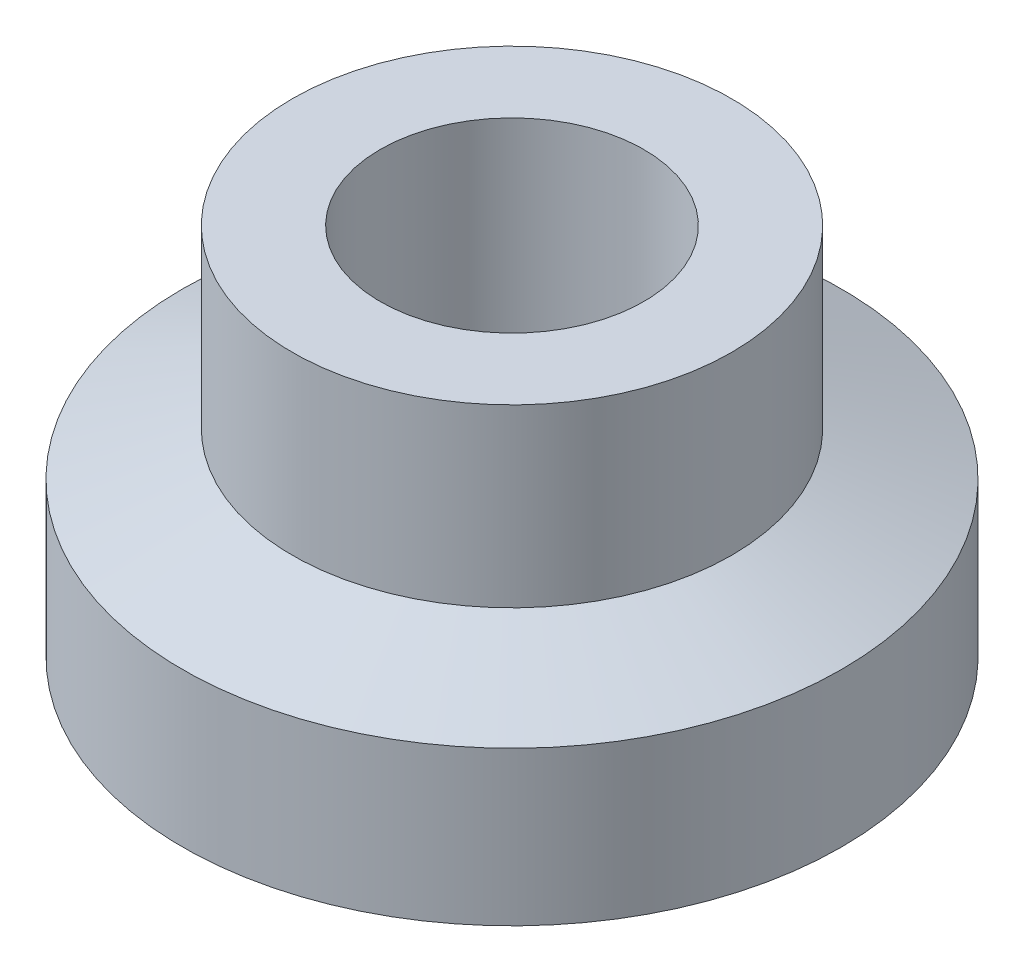
ISO-10303-21;
HEADER;
FILE_DESCRIPTION(('STEP AP214'),'2;1');
FILE_NAME('part.step','',(''),(''),'','','');
FILE_SCHEMA(('AUTOMOTIVE_DESIGN { 1 0 10303 214 1 1 1 1 }'));
ENDSEC;
DATA;
#1=APPLICATION_CONTEXT('core data for automotive mechanical design processes');
#2=APPLICATION_PROTOCOL_DEFINITION('international standard','automotive_design',2000,#1);
#3=PRODUCT_CONTEXT('',#1,'mechanical');
#4=PRODUCT('Part','Part','',(#3));
#5=PRODUCT_RELATED_PRODUCT_CATEGORY('part','',(#4));
#6=PRODUCT_DEFINITION_FORMATION('','',#4);
#7=PRODUCT_DEFINITION_CONTEXT('part definition',#1,'design');
#8=PRODUCT_DEFINITION('design','',#6,#7);
#9=PRODUCT_DEFINITION_SHAPE('','',#8);
#10=(LENGTH_UNIT() NAMED_UNIT(*) SI_UNIT(.MILLI.,.METRE.));
#11=(NAMED_UNIT(*) PLANE_ANGLE_UNIT() SI_UNIT($,.RADIAN.));
#12=(NAMED_UNIT(*) SI_UNIT($,.STERADIAN.) SOLID_ANGLE_UNIT());
#13=UNCERTAINTY_MEASURE_WITH_UNIT(LENGTH_MEASURE(1.E-05),#10,'distance_accuracy_value','');
#14=(GEOMETRIC_REPRESENTATION_CONTEXT(3) GLOBAL_UNCERTAINTY_ASSIGNED_CONTEXT((#13)) GLOBAL_UNIT_ASSIGNED_CONTEXT((#10,
#11,#12)) REPRESENTATION_CONTEXT('',''));
#15=CARTESIAN_POINT('',(0.,0.,0.));
#16=DIRECTION('',(0.,0.,1.));
#17=DIRECTION('',(1.,0.,0.));
#18=AXIS2_PLACEMENT_3D('',#15,#16,#17);
#19=CARTESIAN_POINT('',(0.,0.,0.));
#20=DIRECTION('',(0.,1.,0.));
#21=DIRECTION('',(-1.,0.,0.));
#22=AXIS2_PLACEMENT_3D('',#19,#20,#21);
#23=PLANE('',#22);
#24=CARTESIAN_POINT('',(0.,0.,0.));
#25=DIRECTION('',(0.,-1.,0.));
#26=DIRECTION('',(0.,0.,-1.));
#27=AXIS2_PLACEMENT_3D('',#24,#25,#26);
#28=CIRCLE('',#27,1.65);
#29=CARTESIAN_POINT('',(0.,0.,-1.65));
#30=VERTEX_POINT('',#29);
#31=EDGE_CURVE('E75',#30,#30,#28,.T.);
#32=ORIENTED_EDGE('',*,*,#31,.F.);
#33=EDGE_LOOP('',(#32));
#34=FACE_BOUND('',#33,.T.);
#35=CARTESIAN_POINT('',(0.,0.,0.));
#36=DIRECTION('',(0.,1.,0.));
#37=DIRECTION('',(-1.,0.,0.));
#38=AXIS2_PLACEMENT_3D('',#35,#36,#37);
#39=CIRCLE('',#38,15.);
#40=CARTESIAN_POINT('',(-15.,0.,0.));
#41=VERTEX_POINT('',#40);
#42=EDGE_CURVE('E12',#41,#41,#39,.T.);
#43=ORIENTED_EDGE('',*,*,#42,.F.);
#44=EDGE_LOOP('',(#43));
#45=FACE_BOUND('',#44,.T.);
#46=ADVANCED_FACE('F50',(#34,#45),#23,.F.);
#47=CARTESIAN_POINT('',(0.,5.,0.));
#48=DIRECTION('',(0.,1.,0.));
#49=DIRECTION('',(-1.,0.,0.));
#50=AXIS2_PLACEMENT_3D('',#47,#48,#49);
#51=CYLINDRICAL_SURFACE('',#50,15.);
#52=CARTESIAN_POINT('',(0.,7.,0.));
#53=DIRECTION('',(0.,1.,0.));
#54=DIRECTION('',(-1.,0.,0.));
#55=AXIS2_PLACEMENT_3D('',#52,#53,#54);
#56=CIRCLE('',#55,15.);
#57=CARTESIAN_POINT('',(-15.,7.,0.));
#58=VERTEX_POINT('',#57);
#59=EDGE_CURVE('E57',#58,#58,#56,.T.);
#60=ORIENTED_EDGE('',*,*,#59,.F.);
#61=EDGE_LOOP('',(#60));
#62=FACE_BOUND('',#61,.T.);
#63=ORIENTED_EDGE('',*,*,#42,.T.);
#64=EDGE_LOOP('',(#63));
#65=FACE_BOUND('',#64,.T.);
#66=ADVANCED_FACE('F94',(#62,#65),#51,.T.);
#67=CARTESIAN_POINT('',(0.,7.,0.));
#68=DIRECTION('',(0.,-1.,0.));
#69=DIRECTION('',(1.,0.,0.));
#70=AXIS2_PLACEMENT_3D('',#67,#68,#69);
#71=CONICAL_SURFACE('',#70,15.,1.19028994968253);
#72=CARTESIAN_POINT('',(0.,9.,0.));
#73=DIRECTION('',(0.,1.,0.));
#74=DIRECTION('',(-1.,0.,0.));
#75=AXIS2_PLACEMENT_3D('',#72,#73,#74);
#76=CIRCLE('',#75,10.);
#77=CARTESIAN_POINT('',(-10.,9.,0.));
#78=VERTEX_POINT('',#77);
#79=EDGE_CURVE('E61',#78,#78,#76,.T.);
#80=ORIENTED_EDGE('',*,*,#79,.F.);
#81=EDGE_LOOP('',(#80));
#82=FACE_BOUND('',#81,.T.);
#83=ORIENTED_EDGE('',*,*,#59,.T.);
#84=EDGE_LOOP('',(#83));
#85=FACE_BOUND('',#84,.T.);
#86=ADVANCED_FACE('F99',(#82,#85),#71,.T.);
#87=CARTESIAN_POINT('',(0.,5.,0.));
#88=DIRECTION('',(0.,1.,0.));
#89=DIRECTION('',(-1.,0.,0.));
#90=AXIS2_PLACEMENT_3D('',#87,#88,#89);
#91=CYLINDRICAL_SURFACE('',#90,10.);
#92=CARTESIAN_POINT('',(0.,17.,0.));
#93=DIRECTION('',(0.,1.,0.));
#94=DIRECTION('',(-1.,0.,0.));
#95=AXIS2_PLACEMENT_3D('',#92,#93,#94);
#96=CIRCLE('',#95,10.);
#97=CARTESIAN_POINT('',(-10.,17.,0.));
#98=VERTEX_POINT('',#97);
#99=EDGE_CURVE('E66',#98,#98,#96,.T.);
#100=ORIENTED_EDGE('',*,*,#99,.F.);
#101=EDGE_LOOP('',(#100));
#102=FACE_BOUND('',#101,.T.);
#103=ORIENTED_EDGE('',*,*,#79,.T.);
#104=EDGE_LOOP('',(#103));
#105=FACE_BOUND('',#104,.T.);
#106=ADVANCED_FACE('F105',(#102,#105),#91,.T.);
#107=CARTESIAN_POINT('',(10.,17.,0.));
#108=DIRECTION('',(0.,-1.,0.));
#109=DIRECTION('',(1.,0.,0.));
#110=AXIS2_PLACEMENT_3D('',#107,#108,#109);
#111=PLANE('',#110);
#112=CARTESIAN_POINT('',(0.,17.,0.));
#113=DIRECTION('',(0.,1.,0.));
#114=DIRECTION('',(-1.,0.,0.));
#115=AXIS2_PLACEMENT_3D('',#112,#113,#114);
#116=CIRCLE('',#115,6.);
#117=CARTESIAN_POINT('',(-6.,17.,0.));
#118=VERTEX_POINT('',#117);
#119=EDGE_CURVE('E69',#118,#118,#116,.T.);
#120=ORIENTED_EDGE('',*,*,#119,.F.);
#121=EDGE_LOOP('',(#120));
#122=FACE_BOUND('',#121,.T.);
#123=ORIENTED_EDGE('',*,*,#99,.T.);
#124=EDGE_LOOP('',(#123));
#125=FACE_BOUND('',#124,.T.);
#126=ADVANCED_FACE('F112',(#122,#125),#111,.F.);
#127=CARTESIAN_POINT('',(0.,5.,0.));
#128=DIRECTION('',(0.,1.,0.));
#129=DIRECTION('',(-1.,0.,0.));
#130=AXIS2_PLACEMENT_3D('',#127,#128,#129);
#131=CYLINDRICAL_SURFACE('',#130,6.);
#132=CARTESIAN_POINT('',(0.,5.,0.));
#133=DIRECTION('',(0.,1.,0.));
#134=DIRECTION('',(-1.,0.,0.));
#135=AXIS2_PLACEMENT_3D('',#132,#133,#134);
#136=CIRCLE('',#135,6.);
#137=CARTESIAN_POINT('',(-6.,5.,0.));
#138=VERTEX_POINT('',#137);
#139=EDGE_CURVE('E72',#138,#138,#136,.T.);
#140=ORIENTED_EDGE('',*,*,#139,.F.);
#141=EDGE_LOOP('',(#140));
#142=FACE_BOUND('',#141,.T.);
#143=ORIENTED_EDGE('',*,*,#119,.T.);
#144=EDGE_LOOP('',(#143));
#145=FACE_BOUND('',#144,.T.);
#146=ADVANCED_FACE('F91',(#142,#145),#131,.F.);
#147=CARTESIAN_POINT('',(6.,5.,0.));
#148=DIRECTION('',(0.,-1.,0.));
#149=DIRECTION('',(1.,0.,0.));
#150=AXIS2_PLACEMENT_3D('',#147,#148,#149);
#151=PLANE('',#150);
#152=CARTESIAN_POINT('',(0.,5.,0.));
#153=DIRECTION('',(0.,-1.,0.));
#154=DIRECTION('',(1.,0.,0.));
#155=AXIS2_PLACEMENT_3D('',#152,#153,#154);
#156=CIRCLE('',#155,1.65);
#157=CARTESIAN_POINT('',(1.65,5.,0.));
#158=VERTEX_POINT('',#157);
#159=EDGE_CURVE('E53',#158,#158,#156,.T.);
#160=ORIENTED_EDGE('',*,*,#159,.T.);
#161=EDGE_LOOP('',(#160));
#162=FACE_BOUND('',#161,.T.);
#163=ORIENTED_EDGE('',*,*,#139,.T.);
#164=EDGE_LOOP('',(#163));
#165=FACE_BOUND('',#164,.T.);
#166=ADVANCED_FACE('F82',(#162,#165),#151,.F.);
#167=CARTESIAN_POINT('',(0.,0.,0.));
#168=DIRECTION('',(0.,-1.,0.));
#169=DIRECTION('',(0.,0.,-1.));
#170=AXIS2_PLACEMENT_3D('',#167,#168,#169);
#171=CYLINDRICAL_SURFACE('',#170,1.65);
#172=ORIENTED_EDGE('',*,*,#31,.T.);
#173=EDGE_LOOP('',(#172));
#174=FACE_BOUND('',#173,.T.);
#175=ORIENTED_EDGE('',*,*,#159,.F.);
#176=EDGE_LOOP('',(#175));
#177=FACE_BOUND('',#176,.T.);
#178=ADVANCED_FACE('F85',(#174,#177),#171,.F.);
#179=CLOSED_SHELL('',(#46,#66,#86,#106,#126,#146,#166,#178));
#180=MANIFOLD_SOLID_BREP('B2',#179);
#181=ADVANCED_BREP_SHAPE_REPRESENTATION('',(#18,#180),#14);
#182=SHAPE_DEFINITION_REPRESENTATION(#9,#181);
ENDSEC;
END-ISO-10303-21;
